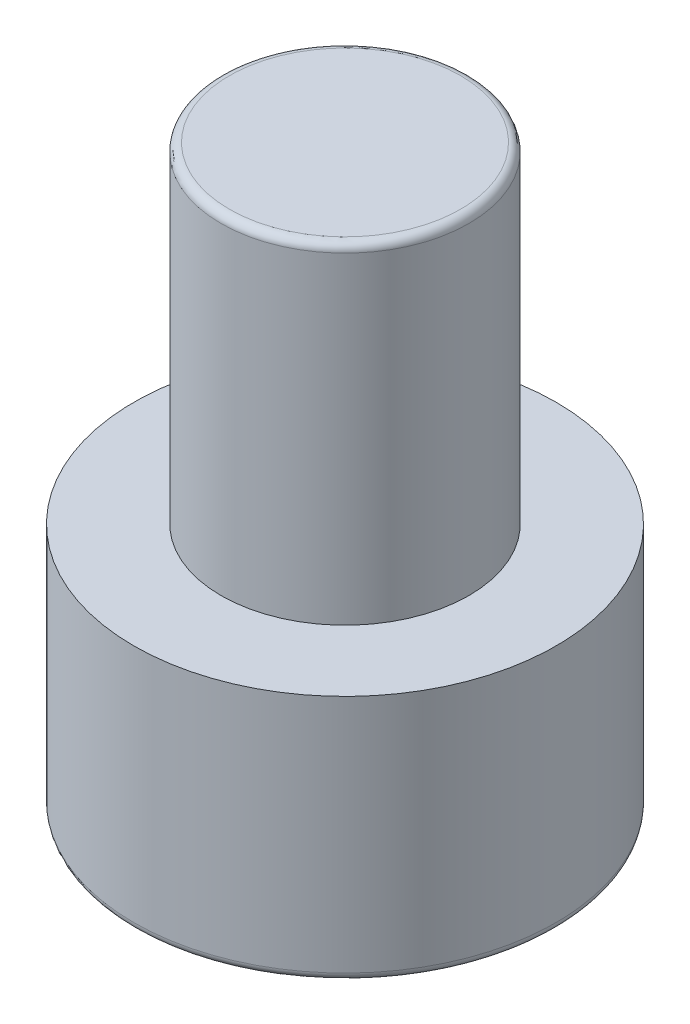
ISO-10303-21;
HEADER;
FILE_DESCRIPTION(('STEP AP214'),'2;1');
FILE_NAME('part.step','',(''),(''),'','','');
FILE_SCHEMA(('AUTOMOTIVE_DESIGN { 1 0 10303 214 1 1 1 1 }'));
ENDSEC;
DATA;
#1=APPLICATION_CONTEXT('core data for automotive mechanical design processes');
#2=APPLICATION_PROTOCOL_DEFINITION('international standard','automotive_design',2000,#1);
#3=PRODUCT_CONTEXT('',#1,'mechanical');
#4=PRODUCT('Part','Part','',(#3));
#5=PRODUCT_RELATED_PRODUCT_CATEGORY('part','',(#4));
#6=PRODUCT_DEFINITION_FORMATION('','',#4);
#7=PRODUCT_DEFINITION_CONTEXT('part definition',#1,'design');
#8=PRODUCT_DEFINITION('design','',#6,#7);
#9=PRODUCT_DEFINITION_SHAPE('','',#8);
#10=(LENGTH_UNIT() NAMED_UNIT(*) SI_UNIT(.MILLI.,.METRE.));
#11=(NAMED_UNIT(*) PLANE_ANGLE_UNIT() SI_UNIT($,.RADIAN.));
#12=(NAMED_UNIT(*) SI_UNIT($,.STERADIAN.) SOLID_ANGLE_UNIT());
#13=UNCERTAINTY_MEASURE_WITH_UNIT(LENGTH_MEASURE(1.E-05),#10,'distance_accuracy_value','');
#14=(GEOMETRIC_REPRESENTATION_CONTEXT(3) GLOBAL_UNCERTAINTY_ASSIGNED_CONTEXT((#13)) GLOBAL_UNIT_ASSIGNED_CONTEXT((#10,
#11,#12)) REPRESENTATION_CONTEXT('',''));
#15=CARTESIAN_POINT('',(0.,0.,0.));
#16=DIRECTION('',(0.,0.,1.));
#17=DIRECTION('',(1.,0.,0.));
#18=AXIS2_PLACEMENT_3D('',#15,#16,#17);
#19=CARTESIAN_POINT('',(6.484633757954,-36.09128417911,123.8131341549));
#20=DIRECTION('',(0.,1.,0.));
#21=DIRECTION('',(0.,0.,1.));
#22=AXIS2_PLACEMENT_3D('',#19,#20,#21);
#23=PLANE('',#22);
#24=CARTESIAN_POINT('',(3.100488266681,-36.09128417911,127.1972796462));
#25=DIRECTION('',(0.,1.,0.));
#26=DIRECTION('',(0.,0.,1.));
#27=AXIS2_PLACEMENT_3D('',#24,#25,#26);
#28=CIRCLE('',#27,2.799999999999);
#29=CARTESIAN_POINT('',(3.100488266681,-36.09128417911,129.997279646199));
#30=VERTEX_POINT('',#29);
#31=EDGE_CURVE('E20',#30,#30,#28,.F.);
#32=ORIENTED_EDGE('',*,*,#31,.F.);
#33=EDGE_LOOP('',(#32));
#34=FACE_BOUND('',#33,.T.);
#35=ADVANCED_FACE('F16',(#34),#23,.T.);
#36=CARTESIAN_POINT('',(6.741155844158,-47.09128417911,130.3534251375));
#37=DIRECTION('',(0.,-1.,0.));
#38=DIRECTION('',(0.,0.,-1.));
#39=AXIS2_PLACEMENT_3D('',#36,#37,#38);
#40=PLANE('',#39);
#41=DIRECTION('',(1.,0.,0.));
#42=VECTOR('',#41,1.);
#43=CARTESIAN_POINT('',(1.268081732306,-47.09128417911,124.5872796462));
#44=LINE('',#43,#42);
#45=CARTESIAN_POINT('',(4.60737246927445,-47.09128417911,124.587279646195));
#46=VERTEX_POINT('',#45);
#47=CARTESIAN_POINT('',(1.59360406408218,-47.09128417911,124.587279646195));
#48=VERTEX_POINT('',#47);
#49=EDGE_CURVE('E136',#46,#48,#44,.F.);
#50=ORIENTED_EDGE('',*,*,#49,.F.);
#51=DIRECTION('',(0.500000000000017,0.,0.866025403784429));
#52=VECTOR('',#51,1.);
#53=CARTESIAN_POINT('',(4.440192371774,-47.09128417911,124.2977152233));
#54=LINE('',#53,#52);
#55=CARTESIAN_POINT('',(6.11425667184748,-47.09128417911,127.197279646191));
#56=VERTEX_POINT('',#55);
#57=EDGE_CURVE('E84',#56,#46,#54,.F.);
#58=ORIENTED_EDGE('',*,*,#57,.F.);
#59=DIRECTION('',(-0.500000000000017,0.,0.866025403784429));
#60=VECTOR('',#59,1.);
#61=CARTESIAN_POINT('',(6.281436769342,-47.09128417911,126.9077152233));
#62=LINE('',#61,#60);
#63=CARTESIAN_POINT('',(4.60737246926008,-47.09128417911,129.807279646198));
#64=VERTEX_POINT('',#63);
#65=EDGE_CURVE('E67',#64,#56,#62,.F.);
#66=ORIENTED_EDGE('',*,*,#65,.F.);
#67=DIRECTION('',(-1.,0.,0.));
#68=VECTOR('',#67,1.);
#69=CARTESIAN_POINT('',(4.932894801056,-47.09128417911,129.8072796462));
#70=LINE('',#69,#68);
#71=CARTESIAN_POINT('',(1.59360406408751,-47.09128417911,129.807279646201));
#72=VERTEX_POINT('',#71);
#73=EDGE_CURVE('E72',#72,#64,#70,.F.);
#74=ORIENTED_EDGE('',*,*,#73,.F.);
#75=DIRECTION('',(-0.500000000000017,0.,-0.866025403784429));
#76=VECTOR('',#75,1.);
#77=CARTESIAN_POINT('',(1.760784161587,-47.09128417911,130.0968440691));
#78=LINE('',#77,#76);
#79=CARTESIAN_POINT('',(0.0867198614871204,-47.09128417911,127.197279646191));
#80=VERTEX_POINT('',#79);
#81=EDGE_CURVE('E128',#80,#72,#78,.F.);
#82=ORIENTED_EDGE('',*,*,#81,.F.);
#83=DIRECTION('',(0.500000000000017,0.,-0.866025403784429));
#84=VECTOR('',#83,1.);
#85=CARTESIAN_POINT('',(-0.0804602359804,-47.09128417911,127.486844069));
#86=LINE('',#85,#84);
#87=EDGE_CURVE('E131',#48,#80,#86,.F.);
#88=ORIENTED_EDGE('',*,*,#87,.F.);
#89=EDGE_LOOP('',(#50,#58,#66,#74,#82,#88));
#90=FACE_BOUND('',#89,.T.);
#91=ADVANCED_FACE('F83',(#90),#40,.T.);
#92=CARTESIAN_POINT('',(3.100488266681,-36.29128417911,127.1972796462));
#93=DIRECTION('',(0.,1.,0.));
#94=DIRECTION('',(0.,0.,1.));
#95=AXIS2_PLACEMENT_3D('',#92,#93,#94);
#96=TOROIDAL_SURFACE('',#95,2.799999999999,0.200000000000002);
#97=ORIENTED_EDGE('',*,*,#31,.T.);
#98=EDGE_LOOP('',(#97));
#99=FACE_BOUND('',#98,.T.);
#100=CARTESIAN_POINT('',(3.100488266681,-36.29128417911,127.1972796462));
#101=DIRECTION('',(0.,1.,0.));
#102=DIRECTION('',(0.,0.,1.));
#103=AXIS2_PLACEMENT_3D('',#100,#101,#102);
#104=CIRCLE('',#103,3.);
#105=CARTESIAN_POINT('',(3.100488266681,-36.29128417911,130.1972796462));
#106=VERTEX_POINT('',#105);
#107=EDGE_CURVE('E122',#106,#106,#104,.F.);
#108=ORIENTED_EDGE('',*,*,#107,.F.);
#109=EDGE_LOOP('',(#108));
#110=FACE_BOUND('',#109,.T.);
#111=ADVANCED_FACE('F252',(#99,#110),#96,.T.);
#112=CARTESIAN_POINT('',(4.932894801056,-46.76713868784,129.8072796462));
#113=DIRECTION('',(0.,0.,-1.));
#114=DIRECTION('',(-1.,0.,0.));
#115=AXIS2_PLACEMENT_3D('',#112,#113,#114);
#116=PLANE('',#115);
#117=ORIENTED_EDGE('',*,*,#73,.T.);
#118=DIRECTION('',(0.,1.,0.));
#119=VECTOR('',#118,1.);
#120=CARTESIAN_POINT('',(4.60737246925246,-46.76713868784,129.807279646192));
#121=LINE('',#120,#119);
#122=CARTESIAN_POINT('',(4.60737246925926,-50.09128417911,129.807279646199));
#123=VERTEX_POINT('',#122);
#124=EDGE_CURVE('E74',#123,#64,#121,.T.);
#125=ORIENTED_EDGE('',*,*,#124,.F.);
#126=DIRECTION('',(1.,0.,0.));
#127=VECTOR('',#126,1.);
#128=CARTESIAN_POINT('',(9.016633757954,-50.09128417911,129.807279646204));
#129=LINE('',#128,#127);
#130=CARTESIAN_POINT('',(1.593604064087,-50.09128417911,129.807279646203));
#131=VERTEX_POINT('',#130);
#132=EDGE_CURVE('E120',#131,#123,#129,.T.);
#133=ORIENTED_EDGE('',*,*,#132,.F.);
#134=DIRECTION('',(0.,1.,0.));
#135=VECTOR('',#134,1.);
#136=CARTESIAN_POINT('',(1.59360406408219,-46.76713868784,129.807279646207));
#137=LINE('',#136,#135);
#138=EDGE_CURVE('E77',#72,#131,#137,.F.);
#139=ORIENTED_EDGE('',*,*,#138,.F.);
#140=EDGE_LOOP('',(#117,#125,#133,#139));
#141=FACE_BOUND('',#140,.T.);
#142=ADVANCED_FACE('F73',(#141),#116,.T.);
#143=CARTESIAN_POINT('',(6.281436769342,-46.76713868784,126.9077152233));
#144=DIRECTION('',(-0.866025403784429,0.,-0.500000000000017));
#145=DIRECTION('',(-0.500000000000017,0.,0.866025403784429));
#146=AXIS2_PLACEMENT_3D('',#143,#144,#145);
#147=PLANE('',#146);
#148=ORIENTED_EDGE('',*,*,#65,.T.);
#149=DIRECTION('',(0.,1.,0.));
#150=VECTOR('',#149,1.);
#151=CARTESIAN_POINT('',(6.11425667186194,-46.76713868784,127.197279646189));
#152=LINE('',#151,#150);
#153=CARTESIAN_POINT('',(6.11425667184832,-50.09128417911,127.197279646191));
#154=VERTEX_POINT('',#153);
#155=EDGE_CURVE('E86',#154,#56,#152,.T.);
#156=ORIENTED_EDGE('',*,*,#155,.F.);
#157=DIRECTION('',(0.500000000000957,0.,-0.866025403783886));
#158=VECTOR('',#157,1.);
#159=CARTESIAN_POINT('',(4.60737246926262,-50.09128417911,129.807279646198));
#160=LINE('',#159,#158);
#161=EDGE_CURVE('E90',#123,#154,#160,.T.);
#162=ORIENTED_EDGE('',*,*,#161,.F.);
#163=ORIENTED_EDGE('',*,*,#124,.T.);
#164=EDGE_LOOP('',(#148,#156,#162,#163));
#165=FACE_BOUND('',#164,.T.);
#166=ADVANCED_FACE('F88',(#165),#147,.T.);
#167=CARTESIAN_POINT('',(4.440192371774,-46.76713868784,124.2977152233));
#168=DIRECTION('',(-0.866025403784429,0.,0.500000000000017));
#169=DIRECTION('',(0.500000000000017,0.,0.866025403784429));
#170=AXIS2_PLACEMENT_3D('',#167,#168,#169);
#171=PLANE('',#170);
#172=ORIENTED_EDGE('',*,*,#57,.T.);
#173=DIRECTION('',(0.,1.,0.));
#174=VECTOR('',#173,1.);
#175=CARTESIAN_POINT('',(4.6073724692724,-46.76713868784,124.5872796462));
#176=LINE('',#175,#174);
#177=CARTESIAN_POINT('',(4.6073724692756,-50.09128417911,124.587279646195));
#178=VERTEX_POINT('',#177);
#179=EDGE_CURVE('E138',#178,#46,#176,.T.);
#180=ORIENTED_EDGE('',*,*,#179,.F.);
#181=DIRECTION('',(-0.49999999999936,0.,-0.866025403784808));
#182=VECTOR('',#181,1.);
#183=CARTESIAN_POINT('',(6.11425667185357,-50.09128417911,127.197279646194));
#184=LINE('',#183,#182);
#185=EDGE_CURVE('E116',#154,#178,#184,.T.);
#186=ORIENTED_EDGE('',*,*,#185,.F.);
#187=ORIENTED_EDGE('',*,*,#155,.T.);
#188=EDGE_LOOP('',(#172,#180,#186,#187));
#189=FACE_BOUND('',#188,.T.);
#190=ADVANCED_FACE('F143',(#189),#171,.T.);
#191=CARTESIAN_POINT('',(1.268081732306,-46.76713868784,124.5872796462));
#192=DIRECTION('',(0.,0.,1.));
#193=DIRECTION('',(1.,0.,0.));
#194=AXIS2_PLACEMENT_3D('',#191,#192,#193);
#195=PLANE('',#194);
#196=ORIENTED_EDGE('',*,*,#49,.T.);
#197=DIRECTION('',(0.,1.,0.));
#198=VECTOR('',#197,1.);
#199=CARTESIAN_POINT('',(1.59360406406569,-46.76713868784,124.587279646183));
#200=LINE('',#199,#198);
#201=CARTESIAN_POINT('',(1.5936040640821,-50.09128417911,124.587279646195));
#202=VERTEX_POINT('',#201);
#203=EDGE_CURVE('E133',#202,#48,#200,.T.);
#204=ORIENTED_EDGE('',*,*,#203,.F.);
#205=DIRECTION('',(1.,0.,0.));
#206=VECTOR('',#205,1.);
#207=CARTESIAN_POINT('',(9.016633757954,-50.09128417911,124.587279646196));
#208=LINE('',#207,#206);
#209=EDGE_CURVE('E109',#178,#202,#208,.F.);
#210=ORIENTED_EDGE('',*,*,#209,.F.);
#211=ORIENTED_EDGE('',*,*,#179,.T.);
#212=EDGE_LOOP('',(#196,#204,#210,#211));
#213=FACE_BOUND('',#212,.T.);
#214=ADVANCED_FACE('F151',(#213),#195,.T.);
#215=CARTESIAN_POINT('',(-0.0804602359804,-46.76713868784,127.486844069));
#216=DIRECTION('',(0.866025403784429,0.,0.500000000000017));
#217=DIRECTION('',(0.500000000000017,0.,-0.866025403784429));
#218=AXIS2_PLACEMENT_3D('',#215,#216,#217);
#219=PLANE('',#218);
#220=ORIENTED_EDGE('',*,*,#87,.T.);
#221=DIRECTION('',(0.,1.,0.));
#222=VECTOR('',#221,1.);
#223=CARTESIAN_POINT('',(0.0867198614899441,-46.76713868784,127.197279646195));
#224=LINE('',#223,#222);
#225=CARTESIAN_POINT('',(0.0867198614852472,-50.09128417911,127.19727964619));
#226=VERTEX_POINT('',#225);
#227=EDGE_CURVE('E35',#226,#80,#224,.T.);
#228=ORIENTED_EDGE('',*,*,#227,.F.);
#229=DIRECTION('',(-0.500000000002895,0.,0.866025403782767));
#230=VECTOR('',#229,1.);
#231=CARTESIAN_POINT('',(1.59360406408767,-50.09128417911,124.587279646196));
#232=LINE('',#231,#230);
#233=EDGE_CURVE('E105',#202,#226,#232,.T.);
#234=ORIENTED_EDGE('',*,*,#233,.F.);
#235=ORIENTED_EDGE('',*,*,#203,.T.);
#236=EDGE_LOOP('',(#220,#228,#234,#235));
#237=FACE_BOUND('',#236,.T.);
#238=ADVANCED_FACE('F149',(#237),#219,.T.);
#239=CARTESIAN_POINT('',(1.760784161587,-46.76713868784,130.0968440691));
#240=DIRECTION('',(0.866025403784429,0.,-0.500000000000017));
#241=DIRECTION('',(-0.500000000000017,0.,-0.866025403784429));
#242=AXIS2_PLACEMENT_3D('',#239,#240,#241);
#243=PLANE('',#242);
#244=ORIENTED_EDGE('',*,*,#81,.T.);
#245=ORIENTED_EDGE('',*,*,#138,.T.);
#246=DIRECTION('',(0.500000000001277,0.,0.866025403783702));
#247=VECTOR('',#246,1.);
#248=CARTESIAN_POINT('',(0.0867198614925499,-50.09128417911,127.197279646193));
#249=LINE('',#248,#247);
#250=EDGE_CURVE('E101',#226,#131,#249,.T.);
#251=ORIENTED_EDGE('',*,*,#250,.F.);
#252=ORIENTED_EDGE('',*,*,#227,.T.);
#253=EDGE_LOOP('',(#244,#245,#251,#252));
#254=FACE_BOUND('',#253,.T.);
#255=ADVANCED_FACE('F147',(#254),#243,.T.);
#256=CARTESIAN_POINT('',(3.100488266681,-40.19128417911,127.1972796462));
#257=DIRECTION('',(0.,1.,0.));
#258=DIRECTION('',(0.,0.,1.));
#259=AXIS2_PLACEMENT_3D('',#256,#257,#258);
#260=CYLINDRICAL_SURFACE('',#259,3.);
#261=ORIENTED_EDGE('',*,*,#107,.T.);
#262=EDGE_LOOP('',(#261));
#263=FACE_BOUND('',#262,.T.);
#264=CARTESIAN_POINT('',(3.100488266681,-44.09128417911,127.1972796462));
#265=DIRECTION('',(0.,1.,0.));
#266=DIRECTION('',(0.,0.,1.));
#267=AXIS2_PLACEMENT_3D('',#264,#265,#266);
#268=CIRCLE('',#267,3.);
#269=CARTESIAN_POINT('',(3.100488266681,-44.09128417911,130.1972796462));
#270=VERTEX_POINT('',#269);
#271=EDGE_CURVE('E99',#270,#270,#268,.F.);
#272=ORIENTED_EDGE('',*,*,#271,.F.);
#273=EDGE_LOOP('',(#272));
#274=FACE_BOUND('',#273,.T.);
#275=ADVANCED_FACE('F177',(#263,#274),#260,.T.);
#276=CARTESIAN_POINT('',(9.016633757954,-50.09128417911,133.1134251375));
#277=DIRECTION('',(0.,-1.,0.));
#278=DIRECTION('',(0.,0.,-1.));
#279=AXIS2_PLACEMENT_3D('',#276,#277,#278);
#280=PLANE('',#279);
#281=CARTESIAN_POINT('',(3.100488266681,-50.09128417911,127.1972796462));
#282=DIRECTION('',(0.,1.,0.));
#283=DIRECTION('',(0.,0.,1.));
#284=AXIS2_PLACEMENT_3D('',#281,#282,#283);
#285=CIRCLE('',#284,4.91);
#286=CARTESIAN_POINT('',(3.100488266681,-50.09128417911,132.1072796462));
#287=VERTEX_POINT('',#286);
#288=EDGE_CURVE('E97',#287,#287,#285,.T.);
#289=ORIENTED_EDGE('',*,*,#288,.F.);
#290=EDGE_LOOP('',(#289));
#291=FACE_BOUND('',#290,.T.);
#292=ORIENTED_EDGE('',*,*,#233,.T.);
#293=ORIENTED_EDGE('',*,*,#250,.T.);
#294=ORIENTED_EDGE('',*,*,#132,.T.);
#295=ORIENTED_EDGE('',*,*,#161,.T.);
#296=ORIENTED_EDGE('',*,*,#185,.T.);
#297=ORIENTED_EDGE('',*,*,#209,.T.);
#298=EDGE_LOOP('',(#292,#293,#294,#295,#296,#297));
#299=FACE_BOUND('',#298,.T.);
#300=ADVANCED_FACE('F145',(#291,#299),#280,.T.);
#301=CARTESIAN_POINT('',(9.256633757954,-44.09128417911,133.3534251375));
#302=DIRECTION('',(0.,1.,0.));
#303=DIRECTION('',(0.,0.,1.));
#304=AXIS2_PLACEMENT_3D('',#301,#302,#303);
#305=PLANE('',#304);
#306=CARTESIAN_POINT('',(3.100488266681,-44.09128417911,127.1972796462));
#307=DIRECTION('',(0.,-1.,0.));
#308=DIRECTION('',(0.,0.,-1.));
#309=AXIS2_PLACEMENT_3D('',#306,#307,#308);
#310=CIRCLE('',#309,5.11);
#311=CARTESIAN_POINT('',(3.100488266681,-44.09128417911,122.0872796462));
#312=VERTEX_POINT('',#311);
#313=EDGE_CURVE('E26',#312,#312,#310,.T.);
#314=ORIENTED_EDGE('',*,*,#313,.F.);
#315=EDGE_LOOP('',(#314));
#316=FACE_BOUND('',#315,.T.);
#317=ORIENTED_EDGE('',*,*,#271,.T.);
#318=EDGE_LOOP('',(#317));
#319=FACE_BOUND('',#318,.T.);
#320=ADVANCED_FACE('F168',(#316,#319),#305,.T.);
#321=CARTESIAN_POINT('',(3.100488266681,-49.89128417911,127.1972796462));
#322=DIRECTION('',(0.,1.,0.));
#323=DIRECTION('',(0.,0.,1.));
#324=AXIS2_PLACEMENT_3D('',#321,#322,#323);
#325=TOROIDAL_SURFACE('',#324,4.91,0.200000000000001);
#326=ORIENTED_EDGE('',*,*,#288,.T.);
#327=EDGE_LOOP('',(#326));
#328=FACE_BOUND('',#327,.T.);
#329=CARTESIAN_POINT('',(3.100488266681,-49.89128417911,127.1972796462));
#330=DIRECTION('',(0.,-1.,0.));
#331=DIRECTION('',(0.,0.,-1.));
#332=AXIS2_PLACEMENT_3D('',#329,#330,#331);
#333=CIRCLE('',#332,5.11);
#334=CARTESIAN_POINT('',(3.100488266681,-49.89128417911,122.0872796462));
#335=VERTEX_POINT('',#334);
#336=EDGE_CURVE('E11',#335,#335,#333,.F.);
#337=ORIENTED_EDGE('',*,*,#336,.F.);
#338=EDGE_LOOP('',(#337));
#339=FACE_BOUND('',#338,.T.);
#340=ADVANCED_FACE('F18',(#328,#339),#325,.T.);
#341=CARTESIAN_POINT('',(3.100488266681,-46.99128417911,127.1972796462));
#342=DIRECTION('',(0.,-1.,0.));
#343=DIRECTION('',(0.,0.,-1.));
#344=AXIS2_PLACEMENT_3D('',#341,#342,#343);
#345=CYLINDRICAL_SURFACE('',#344,5.11);
#346=ORIENTED_EDGE('',*,*,#336,.T.);
#347=EDGE_LOOP('',(#346));
#348=FACE_BOUND('',#347,.T.);
#349=ORIENTED_EDGE('',*,*,#313,.T.);
#350=EDGE_LOOP('',(#349));
#351=FACE_BOUND('',#350,.T.);
#352=ADVANCED_FACE('F161',(#348,#351),#345,.T.);
#353=CLOSED_SHELL('',(#35,#91,#111,#142,#166,#190,#214,#238,#255,#275,#300,#320,#340,#352));
#354=MANIFOLD_SOLID_BREP('B1',#353);
#355=ADVANCED_BREP_SHAPE_REPRESENTATION('',(#18,#354),#14);
#356=SHAPE_DEFINITION_REPRESENTATION(#9,#355);
ENDSEC;
END-ISO-10303-21;
